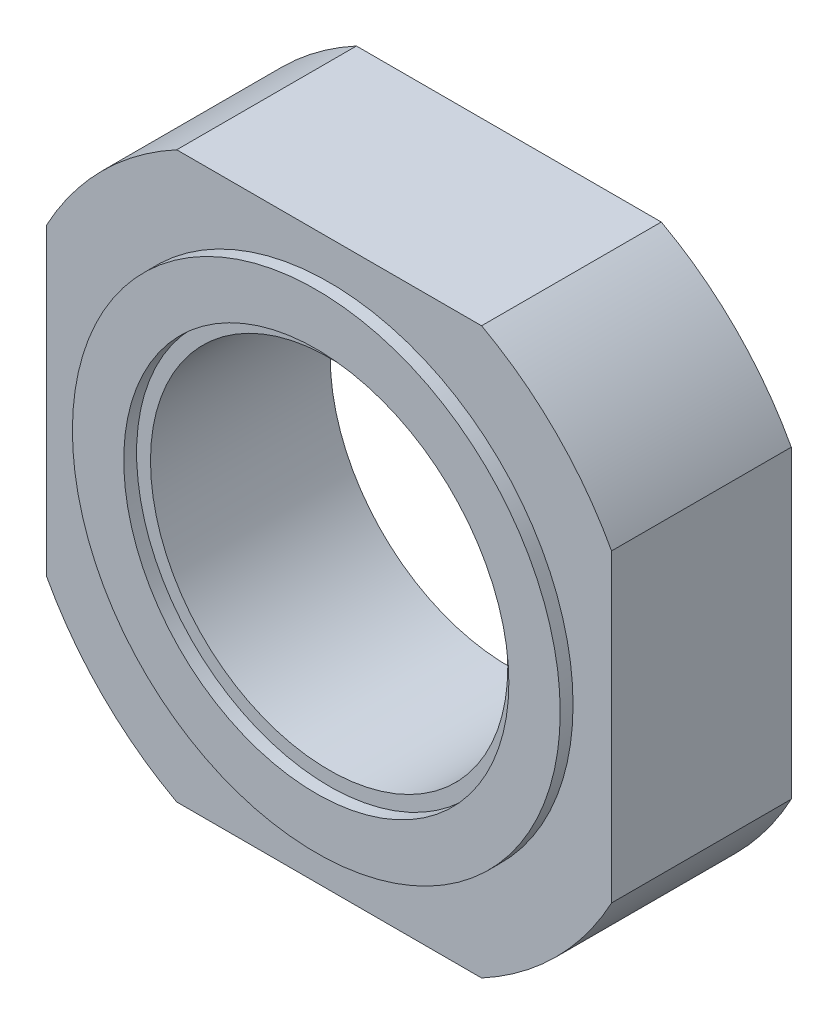
ISO-10303-21;
HEADER;
FILE_DESCRIPTION(('STEP AP214'),'2;1');
FILE_NAME('part.step','',(''),(''),'','','');
FILE_SCHEMA(('AUTOMOTIVE_DESIGN { 1 0 10303 214 1 1 1 1 }'));
ENDSEC;
DATA;
#1=APPLICATION_CONTEXT('core data for automotive mechanical design processes');
#2=APPLICATION_PROTOCOL_DEFINITION('international standard','automotive_design',2000,#1);
#3=PRODUCT_CONTEXT('',#1,'mechanical');
#4=PRODUCT('Part','Part','',(#3));
#5=PRODUCT_RELATED_PRODUCT_CATEGORY('part','',(#4));
#6=PRODUCT_DEFINITION_FORMATION('','',#4);
#7=PRODUCT_DEFINITION_CONTEXT('part definition',#1,'design');
#8=PRODUCT_DEFINITION('design','',#6,#7);
#9=PRODUCT_DEFINITION_SHAPE('','',#8);
#10=(LENGTH_UNIT() NAMED_UNIT(*) SI_UNIT(.MILLI.,.METRE.));
#11=(NAMED_UNIT(*) PLANE_ANGLE_UNIT() SI_UNIT($,.RADIAN.));
#12=(NAMED_UNIT(*) SI_UNIT($,.STERADIAN.) SOLID_ANGLE_UNIT());
#13=UNCERTAINTY_MEASURE_WITH_UNIT(LENGTH_MEASURE(1.E-05),#10,'distance_accuracy_value','');
#14=(GEOMETRIC_REPRESENTATION_CONTEXT(3) GLOBAL_UNCERTAINTY_ASSIGNED_CONTEXT((#13)) GLOBAL_UNIT_ASSIGNED_CONTEXT((#10,
#11,#12)) REPRESENTATION_CONTEXT('',''));
#15=CARTESIAN_POINT('',(0.,0.,0.));
#16=DIRECTION('',(0.,0.,1.));
#17=DIRECTION('',(1.,0.,0.));
#18=AXIS2_PLACEMENT_3D('',#15,#16,#17);
#19=CARTESIAN_POINT('',(-9.5,0.,7.5));
#20=DIRECTION('',(0.,0.,1.));
#21=DIRECTION('',(1.,0.,0.));
#22=AXIS2_PLACEMENT_3D('',#19,#20,#21);
#23=PLANE('',#22);
#24=CARTESIAN_POINT('',(0.,0.,7.5));
#25=DIRECTION('',(0.,0.,-1.));
#26=DIRECTION('',(-1.,0.,0.));
#27=AXIS2_PLACEMENT_3D('',#24,#25,#26);
#28=CIRCLE('',#27,7.5);
#29=CARTESIAN_POINT('',(7.5,0.,7.5));
#30=VERTEX_POINT('',#29);
#31=EDGE_CURVE('E173',#30,#30,#28,.T.);
#32=ORIENTED_EDGE('',*,*,#31,.T.);
#33=EDGE_LOOP('',(#32));
#34=FACE_BOUND('',#33,.T.);
#35=CARTESIAN_POINT('',(0.,0.,7.5));
#36=DIRECTION('',(0.,0.,-1.));
#37=DIRECTION('',(-1.,0.,0.));
#38=AXIS2_PLACEMENT_3D('',#35,#36,#37);
#39=CIRCLE('',#38,9.5);
#40=CARTESIAN_POINT('',(9.5,0.,7.5));
#41=VERTEX_POINT('',#40);
#42=EDGE_CURVE('E25',#41,#41,#39,.T.);
#43=ORIENTED_EDGE('',*,*,#42,.F.);
#44=EDGE_LOOP('',(#43));
#45=FACE_BOUND('',#44,.T.);
#46=ADVANCED_FACE('F17',(#34,#45),#23,.T.);
#47=CARTESIAN_POINT('',(0.,0.,-50.));
#48=DIRECTION('',(0.,0.,1.));
#49=DIRECTION('',(-1.,0.,0.));
#50=AXIS2_PLACEMENT_3D('',#47,#48,#49);
#51=CYLINDRICAL_SURFACE('',#50,9.5);
#52=ORIENTED_EDGE('',*,*,#42,.T.);
#53=DIRECTION('',(0.,0.,-1.));
#54=VECTOR('',#53,1.);
#55=CARTESIAN_POINT('',(9.5,0.,-50.));
#56=LINE('',#55,#54);
#57=CARTESIAN_POINT('',(9.5,0.,7.));
#58=VERTEX_POINT('',#57);
#59=EDGE_CURVE('E11',#41,#58,#56,.T.);
#60=ORIENTED_EDGE('',*,*,#59,.T.);
#61=CARTESIAN_POINT('',(0.,0.,7.));
#62=DIRECTION('',(0.,0.,1.));
#63=DIRECTION('',(1.,0.,0.));
#64=AXIS2_PLACEMENT_3D('',#61,#62,#63);
#65=CIRCLE('',#64,9.5);
#66=EDGE_CURVE('E155',#58,#58,#65,.T.);
#67=ORIENTED_EDGE('',*,*,#66,.T.);
#68=ORIENTED_EDGE('',*,*,#59,.F.);
#69=EDGE_LOOP('',(#52,#60,#67,#68));
#70=FACE_BOUND('',#69,.T.);
#71=ADVANCED_FACE('F251',(#70),#51,.T.);
#72=CARTESIAN_POINT('',(-11.,5.93717104351896,7.));
#73=DIRECTION('',(1.,0.,0.));
#74=DIRECTION('',(0.,1.,0.));
#75=AXIS2_PLACEMENT_3D('',#72,#73,#74);
#76=PLANE('',#75);
#77=DIRECTION('',(0.,-1.,0.));
#78=VECTOR('',#77,1.);
#79=CARTESIAN_POINT('',(-11.,5.93717104351896,0.));
#80=LINE('',#79,#78);
#81=CARTESIAN_POINT('',(-11.,5.93717104351896,0.));
#82=VERTEX_POINT('',#81);
#83=CARTESIAN_POINT('',(-11.,-5.93717104351896,0.));
#84=VERTEX_POINT('',#83);
#85=EDGE_CURVE('E240',#82,#84,#80,.T.);
#86=ORIENTED_EDGE('',*,*,#85,.T.);
#87=DIRECTION('',(0.,0.,-1.));
#88=VECTOR('',#87,1.);
#89=CARTESIAN_POINT('',(-11.,-5.93717104351896,7.));
#90=LINE('',#89,#88);
#91=CARTESIAN_POINT('',(-11.,-5.93717104351896,7.));
#92=VERTEX_POINT('',#91);
#93=EDGE_CURVE('E42',#92,#84,#90,.T.);
#94=ORIENTED_EDGE('',*,*,#93,.F.);
#95=DIRECTION('',(0.,-1.,0.));
#96=VECTOR('',#95,1.);
#97=CARTESIAN_POINT('',(-11.,5.93717104351896,7.));
#98=LINE('',#97,#96);
#99=CARTESIAN_POINT('',(-11.,5.93717104351896,7.));
#100=VERTEX_POINT('',#99);
#101=EDGE_CURVE('E158',#100,#92,#98,.T.);
#102=ORIENTED_EDGE('',*,*,#101,.F.);
#103=DIRECTION('',(0.,0.,-1.));
#104=VECTOR('',#103,1.);
#105=CARTESIAN_POINT('',(-11.,5.93717104351896,7.));
#106=LINE('',#105,#104);
#107=EDGE_CURVE('E143',#100,#82,#106,.T.);
#108=ORIENTED_EDGE('',*,*,#107,.T.);
#109=EDGE_LOOP('',(#86,#94,#102,#108));
#110=FACE_BOUND('',#109,.T.);
#111=ADVANCED_FACE('F265',(#110),#76,.F.);
#112=CARTESIAN_POINT('',(0.,0.,7.));
#113=DIRECTION('',(0.,0.,1.));
#114=DIRECTION('',(-1.,0.,0.));
#115=AXIS2_PLACEMENT_3D('',#112,#113,#114);
#116=CYLINDRICAL_SURFACE('',#115,12.5);
#117=CARTESIAN_POINT('',(0.,0.,0.));
#118=DIRECTION('',(0.,0.,1.));
#119=DIRECTION('',(1.,0.,0.));
#120=AXIS2_PLACEMENT_3D('',#117,#118,#119);
#121=CIRCLE('',#120,12.5);
#122=CARTESIAN_POINT('',(-5.93717104351897,-11.,0.));
#123=VERTEX_POINT('',#122);
#124=EDGE_CURVE('E233',#84,#123,#121,.T.);
#125=ORIENTED_EDGE('',*,*,#124,.T.);
#126=DIRECTION('',(0.,0.,-1.));
#127=VECTOR('',#126,1.);
#128=CARTESIAN_POINT('',(-5.93717104351897,-11.,7.));
#129=LINE('',#128,#127);
#130=CARTESIAN_POINT('',(-5.93717104351897,-11.,7.));
#131=VERTEX_POINT('',#130);
#132=EDGE_CURVE('E210',#131,#123,#129,.T.);
#133=ORIENTED_EDGE('',*,*,#132,.F.);
#134=CARTESIAN_POINT('',(0.,0.,7.));
#135=DIRECTION('',(0.,0.,1.));
#136=DIRECTION('',(1.,0.,0.));
#137=AXIS2_PLACEMENT_3D('',#134,#135,#136);
#138=CIRCLE('',#137,12.5);
#139=EDGE_CURVE('E163',#92,#131,#138,.T.);
#140=ORIENTED_EDGE('',*,*,#139,.F.);
#141=ORIENTED_EDGE('',*,*,#93,.T.);
#142=EDGE_LOOP('',(#125,#133,#140,#141));
#143=FACE_BOUND('',#142,.T.);
#144=ADVANCED_FACE('F298',(#143),#116,.T.);
#145=CARTESIAN_POINT('',(-5.93717104351896,-11.,7.));
#146=DIRECTION('',(0.,1.,0.));
#147=DIRECTION('',(1.,0.,0.));
#148=AXIS2_PLACEMENT_3D('',#145,#146,#147);
#149=PLANE('',#148);
#150=DIRECTION('',(1.,0.,0.));
#151=VECTOR('',#150,1.);
#152=CARTESIAN_POINT('',(-5.93717104351896,-11.,0.));
#153=LINE('',#152,#151);
#154=CARTESIAN_POINT('',(5.93717104351896,-11.,0.));
#155=VERTEX_POINT('',#154);
#156=EDGE_CURVE('E228',#123,#155,#153,.T.);
#157=ORIENTED_EDGE('',*,*,#156,.T.);
#158=DIRECTION('',(0.,0.,-1.));
#159=VECTOR('',#158,1.);
#160=CARTESIAN_POINT('',(5.93717104351896,-11.,7.));
#161=LINE('',#160,#159);
#162=CARTESIAN_POINT('',(5.93717104351896,-11.,7.));
#163=VERTEX_POINT('',#162);
#164=EDGE_CURVE('E244',#163,#155,#161,.T.);
#165=ORIENTED_EDGE('',*,*,#164,.F.);
#166=DIRECTION('',(1.,0.,0.));
#167=VECTOR('',#166,1.);
#168=CARTESIAN_POINT('',(-5.93717104351896,-11.,7.));
#169=LINE('',#168,#167);
#170=EDGE_CURVE('E185',#131,#163,#169,.T.);
#171=ORIENTED_EDGE('',*,*,#170,.F.);
#172=ORIENTED_EDGE('',*,*,#132,.T.);
#173=EDGE_LOOP('',(#157,#165,#171,#172));
#174=FACE_BOUND('',#173,.T.);
#175=ADVANCED_FACE('F303',(#174),#149,.F.);
#176=CARTESIAN_POINT('',(0.,0.,7.));
#177=DIRECTION('',(0.,0.,1.));
#178=DIRECTION('',(-1.,0.,0.));
#179=AXIS2_PLACEMENT_3D('',#176,#177,#178);
#180=CYLINDRICAL_SURFACE('',#179,12.5);
#181=CARTESIAN_POINT('',(0.,0.,0.));
#182=DIRECTION('',(0.,0.,1.));
#183=DIRECTION('',(1.,0.,0.));
#184=AXIS2_PLACEMENT_3D('',#181,#182,#183);
#185=CIRCLE('',#184,12.5);
#186=CARTESIAN_POINT('',(11.,-5.93717104351897,0.));
#187=VERTEX_POINT('',#186);
#188=EDGE_CURVE('E223',#155,#187,#185,.T.);
#189=ORIENTED_EDGE('',*,*,#188,.T.);
#190=DIRECTION('',(0.,0.,-1.));
#191=VECTOR('',#190,1.);
#192=CARTESIAN_POINT('',(11.,-5.93717104351897,7.));
#193=LINE('',#192,#191);
#194=CARTESIAN_POINT('',(11.,-5.93717104351897,7.));
#195=VERTEX_POINT('',#194);
#196=EDGE_CURVE('E245',#195,#187,#193,.T.);
#197=ORIENTED_EDGE('',*,*,#196,.F.);
#198=CARTESIAN_POINT('',(0.,0.,7.));
#199=DIRECTION('',(0.,0.,1.));
#200=DIRECTION('',(1.,0.,0.));
#201=AXIS2_PLACEMENT_3D('',#198,#199,#200);
#202=CIRCLE('',#201,12.5);
#203=EDGE_CURVE('E187',#163,#195,#202,.T.);
#204=ORIENTED_EDGE('',*,*,#203,.F.);
#205=ORIENTED_EDGE('',*,*,#164,.T.);
#206=EDGE_LOOP('',(#189,#197,#204,#205));
#207=FACE_BOUND('',#206,.T.);
#208=ADVANCED_FACE('F301',(#207),#180,.T.);
#209=CARTESIAN_POINT('',(11.,-5.93717104351896,7.));
#210=DIRECTION('',(-1.,0.,0.));
#211=DIRECTION('',(0.,0.,1.));
#212=AXIS2_PLACEMENT_3D('',#209,#210,#211);
#213=PLANE('',#212);
#214=DIRECTION('',(0.,1.,0.));
#215=VECTOR('',#214,1.);
#216=CARTESIAN_POINT('',(11.,-5.93717104351896,0.));
#217=LINE('',#216,#215);
#218=CARTESIAN_POINT('',(11.,5.93717104351896,0.));
#219=VERTEX_POINT('',#218);
#220=EDGE_CURVE('E222',#187,#219,#217,.T.);
#221=ORIENTED_EDGE('',*,*,#220,.T.);
#222=DIRECTION('',(0.,0.,-1.));
#223=VECTOR('',#222,1.);
#224=CARTESIAN_POINT('',(11.,5.93717104351896,7.));
#225=LINE('',#224,#223);
#226=CARTESIAN_POINT('',(11.,5.93717104351896,7.));
#227=VERTEX_POINT('',#226);
#228=EDGE_CURVE('E237',#227,#219,#225,.T.);
#229=ORIENTED_EDGE('',*,*,#228,.F.);
#230=DIRECTION('',(0.,1.,0.));
#231=VECTOR('',#230,1.);
#232=CARTESIAN_POINT('',(11.,-5.93717104351896,7.));
#233=LINE('',#232,#231);
#234=EDGE_CURVE('E169',#195,#227,#233,.T.);
#235=ORIENTED_EDGE('',*,*,#234,.F.);
#236=ORIENTED_EDGE('',*,*,#196,.T.);
#237=EDGE_LOOP('',(#221,#229,#235,#236));
#238=FACE_BOUND('',#237,.T.);
#239=ADVANCED_FACE('F294',(#238),#213,.F.);
#240=CARTESIAN_POINT('',(0.,0.,7.));
#241=DIRECTION('',(0.,0.,1.));
#242=DIRECTION('',(-1.,0.,0.));
#243=AXIS2_PLACEMENT_3D('',#240,#241,#242);
#244=CYLINDRICAL_SURFACE('',#243,12.5);
#245=CARTESIAN_POINT('',(0.,0.,0.));
#246=DIRECTION('',(0.,0.,1.));
#247=DIRECTION('',(1.,0.,0.));
#248=AXIS2_PLACEMENT_3D('',#245,#246,#247);
#249=CIRCLE('',#248,12.5);
#250=CARTESIAN_POINT('',(5.93717104351896,11.,0.));
#251=VERTEX_POINT('',#250);
#252=EDGE_CURVE('E217',#219,#251,#249,.T.);
#253=ORIENTED_EDGE('',*,*,#252,.T.);
#254=DIRECTION('',(0.,0.,-1.));
#255=VECTOR('',#254,1.);
#256=CARTESIAN_POINT('',(5.93717104351896,11.,7.));
#257=LINE('',#256,#255);
#258=CARTESIAN_POINT('',(5.93717104351896,11.,7.));
#259=VERTEX_POINT('',#258);
#260=EDGE_CURVE('E214',#259,#251,#257,.T.);
#261=ORIENTED_EDGE('',*,*,#260,.F.);
#262=CARTESIAN_POINT('',(0.,0.,7.));
#263=DIRECTION('',(0.,0.,1.));
#264=DIRECTION('',(1.,0.,0.));
#265=AXIS2_PLACEMENT_3D('',#262,#263,#264);
#266=CIRCLE('',#265,12.5);
#267=EDGE_CURVE('E147',#227,#259,#266,.T.);
#268=ORIENTED_EDGE('',*,*,#267,.F.);
#269=ORIENTED_EDGE('',*,*,#228,.T.);
#270=EDGE_LOOP('',(#253,#261,#268,#269));
#271=FACE_BOUND('',#270,.T.);
#272=ADVANCED_FACE('F295',(#271),#244,.T.);
#273=CARTESIAN_POINT('',(0.,0.,0.));
#274=DIRECTION('',(0.,0.,1.));
#275=DIRECTION('',(1.,0.,0.));
#276=AXIS2_PLACEMENT_3D('',#273,#274,#275);
#277=PLANE('',#276);
#278=CARTESIAN_POINT('',(0.,0.,0.));
#279=DIRECTION('',(0.,0.,-1.));
#280=DIRECTION('',(-1.,0.,0.));
#281=AXIS2_PLACEMENT_3D('',#278,#279,#280);
#282=CIRCLE('',#281,6.9585);
#283=CARTESIAN_POINT('',(6.9585,0.,0.));
#284=VERTEX_POINT('',#283);
#285=EDGE_CURVE('E172',#284,#284,#282,.T.);
#286=ORIENTED_EDGE('',*,*,#285,.F.);
#287=EDGE_LOOP('',(#286));
#288=FACE_BOUND('',#287,.T.);
#289=CARTESIAN_POINT('',(0.,0.,0.));
#290=DIRECTION('',(0.,0.,1.));
#291=DIRECTION('',(1.,0.,0.));
#292=AXIS2_PLACEMENT_3D('',#289,#290,#291);
#293=CIRCLE('',#292,12.5);
#294=CARTESIAN_POINT('',(-5.93717104351896,11.,0.));
#295=VERTEX_POINT('',#294);
#296=EDGE_CURVE('E183',#295,#82,#293,.T.);
#297=ORIENTED_EDGE('',*,*,#296,.F.);
#298=DIRECTION('',(-1.,0.,0.));
#299=VECTOR('',#298,1.);
#300=CARTESIAN_POINT('',(5.93717104351896,11.,0.));
#301=LINE('',#300,#299);
#302=EDGE_CURVE('E133',#251,#295,#301,.T.);
#303=ORIENTED_EDGE('',*,*,#302,.F.);
#304=ORIENTED_EDGE('',*,*,#252,.F.);
#305=ORIENTED_EDGE('',*,*,#220,.F.);
#306=ORIENTED_EDGE('',*,*,#188,.F.);
#307=ORIENTED_EDGE('',*,*,#156,.F.);
#308=ORIENTED_EDGE('',*,*,#124,.F.);
#309=ORIENTED_EDGE('',*,*,#85,.F.);
#310=EDGE_LOOP('',(#297,#303,#304,#305,#306,#307,#308,#309));
#311=FACE_BOUND('',#310,.T.);
#312=ADVANCED_FACE('F288',(#288,#311),#277,.F.);
#313=CARTESIAN_POINT('',(5.93717104351896,11.,7.));
#314=DIRECTION('',(0.,-1.,0.));
#315=DIRECTION('',(0.,0.,-1.));
#316=AXIS2_PLACEMENT_3D('',#313,#314,#315);
#317=PLANE('',#316);
#318=ORIENTED_EDGE('',*,*,#302,.T.);
#319=DIRECTION('',(0.,0.,-1.));
#320=VECTOR('',#319,1.);
#321=CARTESIAN_POINT('',(-5.93717104351896,11.,7.));
#322=LINE('',#321,#320);
#323=CARTESIAN_POINT('',(-5.93717104351896,11.,7.));
#324=VERTEX_POINT('',#323);
#325=EDGE_CURVE('E126',#324,#295,#322,.T.);
#326=ORIENTED_EDGE('',*,*,#325,.F.);
#327=DIRECTION('',(-1.,0.,0.));
#328=VECTOR('',#327,1.);
#329=CARTESIAN_POINT('',(5.93717104351896,11.,7.));
#330=LINE('',#329,#328);
#331=EDGE_CURVE('E131',#259,#324,#330,.T.);
#332=ORIENTED_EDGE('',*,*,#331,.F.);
#333=ORIENTED_EDGE('',*,*,#260,.T.);
#334=EDGE_LOOP('',(#318,#326,#332,#333));
#335=FACE_BOUND('',#334,.T.);
#336=ADVANCED_FACE('F127',(#335),#317,.F.);
#337=CARTESIAN_POINT('',(0.,0.,-50.));
#338=DIRECTION('',(0.,0.,1.));
#339=DIRECTION('',(-1.,0.,0.));
#340=AXIS2_PLACEMENT_3D('',#337,#338,#339);
#341=CYLINDRICAL_SURFACE('',#340,7.5);
#342=CARTESIAN_POINT('',(0.,0.,7.));
#343=DIRECTION('',(0.,0.,-1.));
#344=DIRECTION('',(1.,0.,0.));
#345=AXIS2_PLACEMENT_3D('',#342,#343,#344);
#346=CIRCLE('',#345,7.5);
#347=CARTESIAN_POINT('',(7.5,0.,7.));
#348=VERTEX_POINT('',#347);
#349=EDGE_CURVE('E139',#348,#348,#346,.T.);
#350=ORIENTED_EDGE('',*,*,#349,.T.);
#351=DIRECTION('',(0.,0.,1.));
#352=VECTOR('',#351,1.);
#353=CARTESIAN_POINT('',(7.5,0.,-50.));
#354=LINE('',#353,#352);
#355=EDGE_CURVE('E180',#348,#30,#354,.T.);
#356=ORIENTED_EDGE('',*,*,#355,.T.);
#357=ORIENTED_EDGE('',*,*,#31,.F.);
#358=ORIENTED_EDGE('',*,*,#355,.F.);
#359=EDGE_LOOP('',(#350,#356,#357,#358));
#360=FACE_BOUND('',#359,.T.);
#361=ADVANCED_FACE('F266',(#360),#341,.F.);
#362=CARTESIAN_POINT('',(0.,0.,0.));
#363=DIRECTION('',(0.,0.,1.));
#364=DIRECTION('',(-1.,0.,0.));
#365=AXIS2_PLACEMENT_3D('',#362,#363,#364);
#366=CYLINDRICAL_SURFACE('',#365,6.9585);
#367=ORIENTED_EDGE('',*,*,#285,.T.);
#368=DIRECTION('',(0.,0.,1.));
#369=VECTOR('',#368,1.);
#370=CARTESIAN_POINT('',(6.9585,0.,0.));
#371=LINE('',#370,#369);
#372=CARTESIAN_POINT('',(6.9585,0.,7.));
#373=VERTEX_POINT('',#372);
#374=EDGE_CURVE('E201',#284,#373,#371,.T.);
#375=ORIENTED_EDGE('',*,*,#374,.T.);
#376=CARTESIAN_POINT('',(0.,0.,7.));
#377=DIRECTION('',(0.,0.,-1.));
#378=DIRECTION('',(1.,0.,0.));
#379=AXIS2_PLACEMENT_3D('',#376,#377,#378);
#380=CIRCLE('',#379,6.9585);
#381=EDGE_CURVE('E166',#373,#373,#380,.T.);
#382=ORIENTED_EDGE('',*,*,#381,.F.);
#383=ORIENTED_EDGE('',*,*,#374,.F.);
#384=EDGE_LOOP('',(#367,#375,#382,#383));
#385=FACE_BOUND('',#384,.T.);
#386=ADVANCED_FACE('F271',(#385),#366,.F.);
#387=CARTESIAN_POINT('',(0.,0.,7.));
#388=DIRECTION('',(0.,0.,1.));
#389=DIRECTION('',(1.,0.,0.));
#390=AXIS2_PLACEMENT_3D('',#387,#388,#389);
#391=PLANE('',#390);
#392=ORIENTED_EDGE('',*,*,#381,.T.);
#393=EDGE_LOOP('',(#392));
#394=FACE_BOUND('',#393,.T.);
#395=ORIENTED_EDGE('',*,*,#349,.F.);
#396=EDGE_LOOP('',(#395));
#397=FACE_BOUND('',#396,.T.);
#398=ADVANCED_FACE('F267',(#394,#397),#391,.T.);
#399=CARTESIAN_POINT('',(0.,0.,7.));
#400=DIRECTION('',(0.,0.,1.));
#401=DIRECTION('',(-1.,0.,0.));
#402=AXIS2_PLACEMENT_3D('',#399,#400,#401);
#403=CYLINDRICAL_SURFACE('',#402,12.5);
#404=ORIENTED_EDGE('',*,*,#296,.T.);
#405=ORIENTED_EDGE('',*,*,#107,.F.);
#406=CARTESIAN_POINT('',(0.,0.,7.));
#407=DIRECTION('',(0.,0.,1.));
#408=DIRECTION('',(1.,0.,0.));
#409=AXIS2_PLACEMENT_3D('',#406,#407,#408);
#410=CIRCLE('',#409,12.5);
#411=EDGE_CURVE('E150',#324,#100,#410,.T.);
#412=ORIENTED_EDGE('',*,*,#411,.F.);
#413=ORIENTED_EDGE('',*,*,#325,.T.);
#414=EDGE_LOOP('',(#404,#405,#412,#413));
#415=FACE_BOUND('',#414,.T.);
#416=ADVANCED_FACE('F152',(#415),#403,.T.);
#417=CARTESIAN_POINT('',(0.,0.,7.));
#418=DIRECTION('',(0.,0.,1.));
#419=DIRECTION('',(1.,0.,0.));
#420=AXIS2_PLACEMENT_3D('',#417,#418,#419);
#421=PLANE('',#420);
#422=ORIENTED_EDGE('',*,*,#66,.F.);
#423=EDGE_LOOP('',(#422));
#424=FACE_BOUND('',#423,.T.);
#425=ORIENTED_EDGE('',*,*,#411,.T.);
#426=ORIENTED_EDGE('',*,*,#101,.T.);
#427=ORIENTED_EDGE('',*,*,#139,.T.);
#428=ORIENTED_EDGE('',*,*,#170,.T.);
#429=ORIENTED_EDGE('',*,*,#203,.T.);
#430=ORIENTED_EDGE('',*,*,#234,.T.);
#431=ORIENTED_EDGE('',*,*,#267,.T.);
#432=ORIENTED_EDGE('',*,*,#331,.T.);
#433=EDGE_LOOP('',(#425,#426,#427,#428,#429,#430,#431,#432));
#434=FACE_BOUND('',#433,.T.);
#435=ADVANCED_FACE('F144',(#424,#434),#421,.T.);
#436=CLOSED_SHELL('',(#46,#71,#111,#144,#175,#208,#239,#272,#312,#336,#361,#386,#398,#416,#435));
#437=MANIFOLD_SOLID_BREP('B1',#436);
#438=ADVANCED_BREP_SHAPE_REPRESENTATION('',(#18,#437),#14);
#439=SHAPE_DEFINITION_REPRESENTATION(#9,#438);
ENDSEC;
END-ISO-10303-21;
